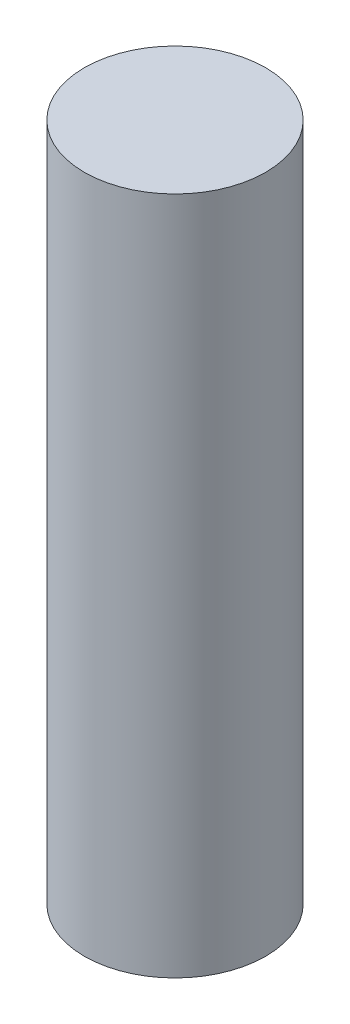
ISO-10303-21;
HEADER;
FILE_DESCRIPTION(('STEP AP214'),'2;1');
FILE_NAME('part.step','',(''),(''),'','','');
FILE_SCHEMA(('AUTOMOTIVE_DESIGN { 1 0 10303 214 1 1 1 1 }'));
ENDSEC;
DATA;
#1=APPLICATION_CONTEXT('core data for automotive mechanical design processes');
#2=APPLICATION_PROTOCOL_DEFINITION('international standard','automotive_design',2000,#1);
#3=PRODUCT_CONTEXT('',#1,'mechanical');
#4=PRODUCT('Part','Part','',(#3));
#5=PRODUCT_RELATED_PRODUCT_CATEGORY('part','',(#4));
#6=PRODUCT_DEFINITION_FORMATION('','',#4);
#7=PRODUCT_DEFINITION_CONTEXT('part definition',#1,'design');
#8=PRODUCT_DEFINITION('design','',#6,#7);
#9=PRODUCT_DEFINITION_SHAPE('','',#8);
#10=(LENGTH_UNIT() NAMED_UNIT(*) SI_UNIT(.MILLI.,.METRE.));
#11=(NAMED_UNIT(*) PLANE_ANGLE_UNIT() SI_UNIT($,.RADIAN.));
#12=(NAMED_UNIT(*) SI_UNIT($,.STERADIAN.) SOLID_ANGLE_UNIT());
#13=UNCERTAINTY_MEASURE_WITH_UNIT(LENGTH_MEASURE(1.E-05),#10,'distance_accuracy_value','');
#14=(GEOMETRIC_REPRESENTATION_CONTEXT(3) GLOBAL_UNCERTAINTY_ASSIGNED_CONTEXT((#13)) GLOBAL_UNIT_ASSIGNED_CONTEXT((#10,
#11,#12)) REPRESENTATION_CONTEXT('',''));
#15=CARTESIAN_POINT('',(0.,0.,0.));
#16=DIRECTION('',(0.,0.,1.));
#17=DIRECTION('',(1.,0.,0.));
#18=AXIS2_PLACEMENT_3D('',#15,#16,#17);
#19=CARTESIAN_POINT('',(0.,100.,0.));
#20=DIRECTION('',(0.,-1.,0.));
#21=DIRECTION('',(0.,0.,-1.));
#22=AXIS2_PLACEMENT_3D('',#19,#20,#21);
#23=CYLINDRICAL_SURFACE('',#22,13.35);
#24=CARTESIAN_POINT('',(0.,100.,0.));
#25=DIRECTION('',(0.,1.,0.));
#26=DIRECTION('',(0.,0.,1.));
#27=AXIS2_PLACEMENT_3D('',#24,#25,#26);
#28=CIRCLE('',#27,13.35);
#29=CARTESIAN_POINT('',(0.,100.,13.35));
#30=VERTEX_POINT('',#29);
#31=EDGE_CURVE('E10',#30,#30,#28,.T.);
#32=ORIENTED_EDGE('',*,*,#31,.F.);
#33=EDGE_LOOP('',(#32));
#34=FACE_BOUND('',#33,.T.);
#35=CARTESIAN_POINT('',(0.,0.,0.));
#36=DIRECTION('',(0.,1.,0.));
#37=DIRECTION('',(0.,0.,1.));
#38=AXIS2_PLACEMENT_3D('',#35,#36,#37);
#39=CIRCLE('',#38,13.35);
#40=CARTESIAN_POINT('',(0.,0.,13.35));
#41=VERTEX_POINT('',#40);
#42=EDGE_CURVE('E34',#41,#41,#39,.T.);
#43=ORIENTED_EDGE('',*,*,#42,.T.);
#44=EDGE_LOOP('',(#43));
#45=FACE_BOUND('',#44,.T.);
#46=ADVANCED_FACE('F31',(#34,#45),#23,.T.);
#47=CARTESIAN_POINT('',(0.,100.,0.));
#48=DIRECTION('',(0.,1.,0.));
#49=DIRECTION('',(0.,0.,1.));
#50=AXIS2_PLACEMENT_3D('',#47,#48,#49);
#51=PLANE('',#50);
#52=ORIENTED_EDGE('',*,*,#31,.T.);
#53=EDGE_LOOP('',(#52));
#54=FACE_BOUND('',#53,.T.);
#55=ADVANCED_FACE('F46',(#54),#51,.T.);
#56=CARTESIAN_POINT('',(0.,0.,0.));
#57=DIRECTION('',(0.,1.,0.));
#58=DIRECTION('',(0.,0.,1.));
#59=AXIS2_PLACEMENT_3D('',#56,#57,#58);
#60=PLANE('',#59);
#61=ORIENTED_EDGE('',*,*,#42,.F.);
#62=EDGE_LOOP('',(#61));
#63=FACE_BOUND('',#62,.T.);
#64=ADVANCED_FACE('F44',(#63),#60,.F.);
#65=CLOSED_SHELL('',(#46,#55,#64));
#66=MANIFOLD_SOLID_BREP('B2',#65);
#67=ADVANCED_BREP_SHAPE_REPRESENTATION('',(#18,#66),#14);
#68=SHAPE_DEFINITION_REPRESENTATION(#9,#67);
ENDSEC;
END-ISO-10303-21;
